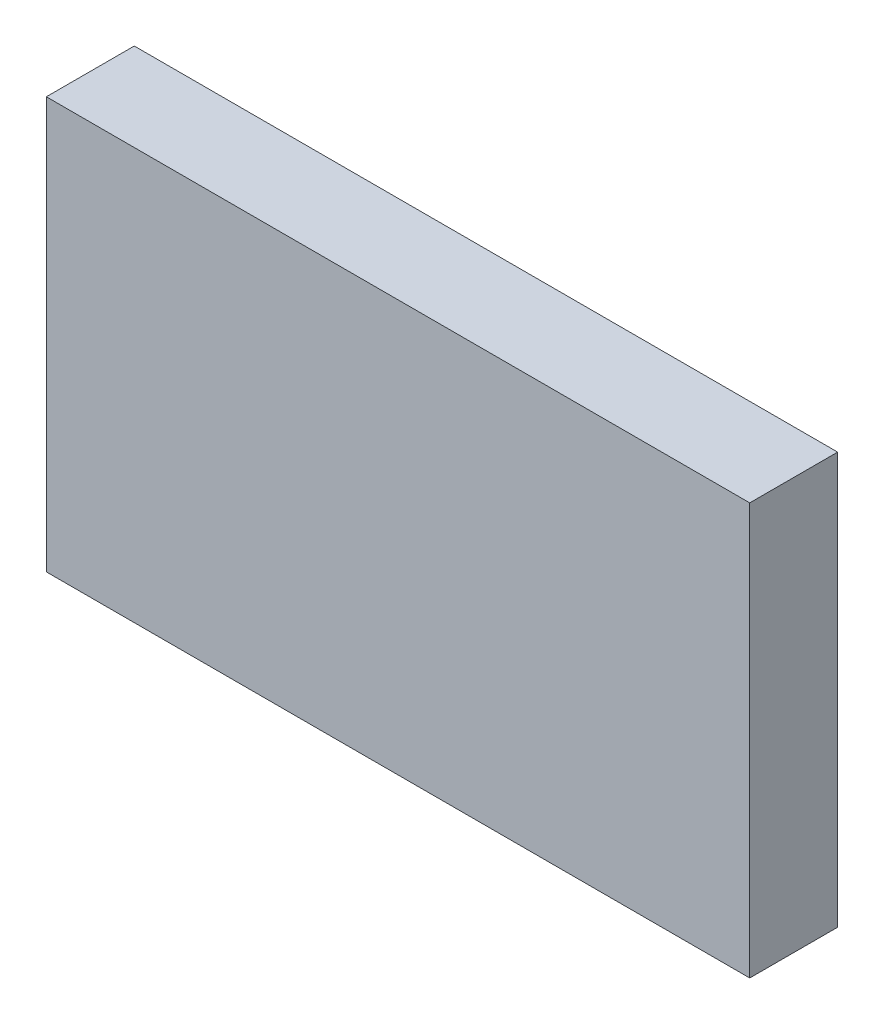
ISO-10303-21;
HEADER;
FILE_DESCRIPTION(('STEP AP214'),'2;1');
FILE_NAME('part.step','',(''),(''),'','','');
FILE_SCHEMA(('AUTOMOTIVE_DESIGN { 1 0 10303 214 1 1 1 1 }'));
ENDSEC;
DATA;
#1=APPLICATION_CONTEXT('core data for automotive mechanical design processes');
#2=APPLICATION_PROTOCOL_DEFINITION('international standard','automotive_design',2000,#1);
#3=PRODUCT_CONTEXT('',#1,'mechanical');
#4=PRODUCT('Part','Part','',(#3));
#5=PRODUCT_RELATED_PRODUCT_CATEGORY('part','',(#4));
#6=PRODUCT_DEFINITION_FORMATION('','',#4);
#7=PRODUCT_DEFINITION_CONTEXT('part definition',#1,'design');
#8=PRODUCT_DEFINITION('design','',#6,#7);
#9=PRODUCT_DEFINITION_SHAPE('','',#8);
#10=(LENGTH_UNIT() NAMED_UNIT(*) SI_UNIT(.MILLI.,.METRE.));
#11=(NAMED_UNIT(*) PLANE_ANGLE_UNIT() SI_UNIT($,.RADIAN.));
#12=(NAMED_UNIT(*) SI_UNIT($,.STERADIAN.) SOLID_ANGLE_UNIT());
#13=UNCERTAINTY_MEASURE_WITH_UNIT(LENGTH_MEASURE(1.E-05),#10,'distance_accuracy_value','');
#14=(GEOMETRIC_REPRESENTATION_CONTEXT(3) GLOBAL_UNCERTAINTY_ASSIGNED_CONTEXT((#13)) GLOBAL_UNIT_ASSIGNED_CONTEXT((#10,
#11,#12)) REPRESENTATION_CONTEXT('',''));
#15=CARTESIAN_POINT('',(0.,0.,0.));
#16=DIRECTION('',(0.,0.,1.));
#17=DIRECTION('',(1.,0.,0.));
#18=AXIS2_PLACEMENT_3D('',#15,#16,#17);
#19=CARTESIAN_POINT('',(25.4,-14.859,6.35));
#20=DIRECTION('',(-1.,0.,0.));
#21=DIRECTION('',(0.,0.,1.));
#22=AXIS2_PLACEMENT_3D('',#19,#20,#21);
#23=PLANE('',#22);
#24=DIRECTION('',(0.,1.,0.));
#25=VECTOR('',#24,1.);
#26=CARTESIAN_POINT('',(25.4,-14.859,0.));
#27=LINE('',#26,#25);
#28=CARTESIAN_POINT('',(25.4,-14.859,0.));
#29=VERTEX_POINT('',#28);
#30=CARTESIAN_POINT('',(25.4,14.859,0.));
#31=VERTEX_POINT('',#30);
#32=EDGE_CURVE('E96',#29,#31,#27,.T.);
#33=ORIENTED_EDGE('',*,*,#32,.T.);
#34=DIRECTION('',(0.,0.,-1.));
#35=VECTOR('',#34,1.);
#36=CARTESIAN_POINT('',(25.4,14.859,6.35));
#37=LINE('',#36,#35);
#38=CARTESIAN_POINT('',(25.4,14.859,6.35));
#39=VERTEX_POINT('',#38);
#40=EDGE_CURVE('E11',#39,#31,#37,.T.);
#41=ORIENTED_EDGE('',*,*,#40,.F.);
#42=DIRECTION('',(0.,1.,0.));
#43=VECTOR('',#42,1.);
#44=CARTESIAN_POINT('',(25.4,-14.859,6.35));
#45=LINE('',#44,#43);
#46=CARTESIAN_POINT('',(25.4,-14.859,6.35));
#47=VERTEX_POINT('',#46);
#48=EDGE_CURVE('E84',#47,#39,#45,.T.);
#49=ORIENTED_EDGE('',*,*,#48,.F.);
#50=DIRECTION('',(0.,0.,-1.));
#51=VECTOR('',#50,1.);
#52=CARTESIAN_POINT('',(25.4,-14.859,6.35));
#53=LINE('',#52,#51);
#54=EDGE_CURVE('E92',#47,#29,#53,.T.);
#55=ORIENTED_EDGE('',*,*,#54,.T.);
#56=EDGE_LOOP('',(#33,#41,#49,#55));
#57=FACE_BOUND('',#56,.T.);
#58=ADVANCED_FACE('F33',(#57),#23,.F.);
#59=CARTESIAN_POINT('',(-25.4,14.859,6.35));
#60=DIRECTION('',(0.,-1.,0.));
#61=DIRECTION('',(0.,0.,-1.));
#62=AXIS2_PLACEMENT_3D('',#59,#60,#61);
#63=PLANE('',#62);
#64=DIRECTION('',(-1.,0.,0.));
#65=VECTOR('',#64,1.);
#66=CARTESIAN_POINT('',(-25.4,14.859,0.));
#67=LINE('',#66,#65);
#68=CARTESIAN_POINT('',(-25.4,14.859,0.));
#69=VERTEX_POINT('',#68);
#70=EDGE_CURVE('E88',#31,#69,#67,.T.);
#71=ORIENTED_EDGE('',*,*,#70,.T.);
#72=DIRECTION('',(0.,0.,-1.));
#73=VECTOR('',#72,1.);
#74=CARTESIAN_POINT('',(-25.4,14.859,6.35));
#75=LINE('',#74,#73);
#76=CARTESIAN_POINT('',(-25.4,14.859,6.35));
#77=VERTEX_POINT('',#76);
#78=EDGE_CURVE('E41',#77,#69,#75,.T.);
#79=ORIENTED_EDGE('',*,*,#78,.F.);
#80=DIRECTION('',(-1.,0.,0.));
#81=VECTOR('',#80,1.);
#82=CARTESIAN_POINT('',(-25.4,14.859,6.35));
#83=LINE('',#82,#81);
#84=EDGE_CURVE('E79',#39,#77,#83,.T.);
#85=ORIENTED_EDGE('',*,*,#84,.F.);
#86=ORIENTED_EDGE('',*,*,#40,.T.);
#87=EDGE_LOOP('',(#71,#79,#85,#86));
#88=FACE_BOUND('',#87,.T.);
#89=ADVANCED_FACE('F87',(#88),#63,.F.);
#90=CARTESIAN_POINT('',(-25.4,-14.859,6.35));
#91=DIRECTION('',(1.,0.,0.));
#92=DIRECTION('',(0.,0.,-1.));
#93=AXIS2_PLACEMENT_3D('',#90,#91,#92);
#94=PLANE('',#93);
#95=DIRECTION('',(0.,-1.,0.));
#96=VECTOR('',#95,1.);
#97=CARTESIAN_POINT('',(-25.4,-14.859,0.));
#98=LINE('',#97,#96);
#99=CARTESIAN_POINT('',(-25.4,-14.859,0.));
#100=VERTEX_POINT('',#99);
#101=EDGE_CURVE('E66',#69,#100,#98,.T.);
#102=ORIENTED_EDGE('',*,*,#101,.T.);
#103=DIRECTION('',(0.,0.,-1.));
#104=VECTOR('',#103,1.);
#105=CARTESIAN_POINT('',(-25.4,-14.859,6.35));
#106=LINE('',#105,#104);
#107=CARTESIAN_POINT('',(-25.4,-14.859,6.35));
#108=VERTEX_POINT('',#107);
#109=EDGE_CURVE('E89',#108,#100,#106,.T.);
#110=ORIENTED_EDGE('',*,*,#109,.F.);
#111=DIRECTION('',(0.,-1.,0.));
#112=VECTOR('',#111,1.);
#113=CARTESIAN_POINT('',(-25.4,-14.859,6.35));
#114=LINE('',#113,#112);
#115=EDGE_CURVE('E82',#77,#108,#114,.T.);
#116=ORIENTED_EDGE('',*,*,#115,.F.);
#117=ORIENTED_EDGE('',*,*,#78,.T.);
#118=EDGE_LOOP('',(#102,#110,#116,#117));
#119=FACE_BOUND('',#118,.T.);
#120=ADVANCED_FACE('F90',(#119),#94,.F.);
#121=CARTESIAN_POINT('',(-25.4,-14.859,6.35));
#122=DIRECTION('',(0.,1.,0.));
#123=DIRECTION('',(0.,0.,1.));
#124=AXIS2_PLACEMENT_3D('',#121,#122,#123);
#125=PLANE('',#124);
#126=DIRECTION('',(1.,0.,0.));
#127=VECTOR('',#126,1.);
#128=CARTESIAN_POINT('',(-25.4,-14.859,0.));
#129=LINE('',#128,#127);
#130=EDGE_CURVE('E72',#100,#29,#129,.T.);
#131=ORIENTED_EDGE('',*,*,#130,.T.);
#132=ORIENTED_EDGE('',*,*,#54,.F.);
#133=DIRECTION('',(1.,0.,0.));
#134=VECTOR('',#133,1.);
#135=CARTESIAN_POINT('',(-25.4,-14.859,6.35));
#136=LINE('',#135,#134);
#137=EDGE_CURVE('E49',#108,#47,#136,.T.);
#138=ORIENTED_EDGE('',*,*,#137,.F.);
#139=ORIENTED_EDGE('',*,*,#109,.T.);
#140=EDGE_LOOP('',(#131,#132,#138,#139));
#141=FACE_BOUND('',#140,.T.);
#142=ADVANCED_FACE('F103',(#141),#125,.F.);
#143=CARTESIAN_POINT('',(0.,0.,6.35));
#144=DIRECTION('',(0.,0.,-1.));
#145=DIRECTION('',(-1.,0.,0.));
#146=AXIS2_PLACEMENT_3D('',#143,#144,#145);
#147=PLANE('',#146);
#148=ORIENTED_EDGE('',*,*,#48,.T.);
#149=ORIENTED_EDGE('',*,*,#84,.T.);
#150=ORIENTED_EDGE('',*,*,#115,.T.);
#151=ORIENTED_EDGE('',*,*,#137,.T.);
#152=EDGE_LOOP('',(#148,#149,#150,#151));
#153=FACE_BOUND('',#152,.T.);
#154=ADVANCED_FACE('F80',(#153),#147,.F.);
#155=CARTESIAN_POINT('',(0.,0.,0.));
#156=DIRECTION('',(0.,0.,-1.));
#157=DIRECTION('',(-1.,0.,0.));
#158=AXIS2_PLACEMENT_3D('',#155,#156,#157);
#159=PLANE('',#158);
#160=ORIENTED_EDGE('',*,*,#32,.F.);
#161=ORIENTED_EDGE('',*,*,#130,.F.);
#162=ORIENTED_EDGE('',*,*,#101,.F.);
#163=ORIENTED_EDGE('',*,*,#70,.F.);
#164=EDGE_LOOP('',(#160,#161,#162,#163));
#165=FACE_BOUND('',#164,.T.);
#166=ADVANCED_FACE('F106',(#165),#159,.T.);
#167=CLOSED_SHELL('',(#58,#89,#120,#142,#154,#166));
#168=MANIFOLD_SOLID_BREP('B2',#167);
#169=ADVANCED_BREP_SHAPE_REPRESENTATION('',(#18,#168),#14);
#170=SHAPE_DEFINITION_REPRESENTATION(#9,#169);
ENDSEC;
END-ISO-10303-21;
